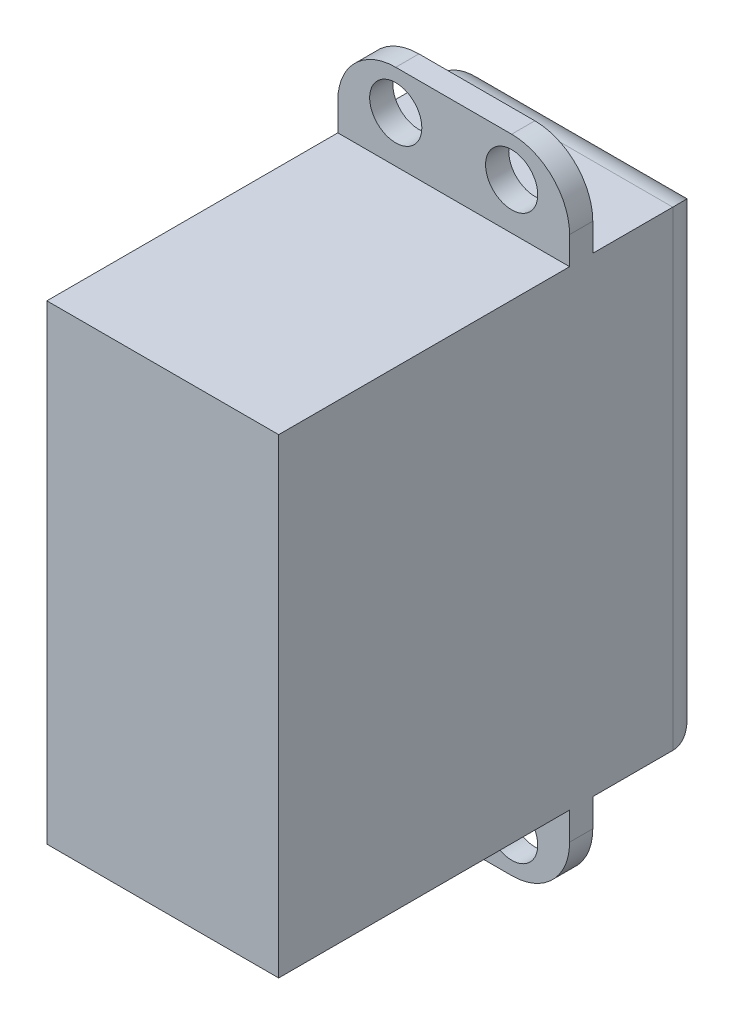
ISO-10303-21;
HEADER;
FILE_DESCRIPTION(('STEP AP214'),'2;1');
FILE_NAME('part.step','',(''),(''),'','','');
FILE_SCHEMA(('AUTOMOTIVE_DESIGN { 1 0 10303 214 1 1 1 1 }'));
ENDSEC;
DATA;
#1=APPLICATION_CONTEXT('core data for automotive mechanical design processes');
#2=APPLICATION_PROTOCOL_DEFINITION('international standard','automotive_design',2000,#1);
#3=PRODUCT_CONTEXT('',#1,'mechanical');
#4=PRODUCT('Part','Part','',(#3));
#5=PRODUCT_RELATED_PRODUCT_CATEGORY('part','',(#4));
#6=PRODUCT_DEFINITION_FORMATION('','',#4);
#7=PRODUCT_DEFINITION_CONTEXT('part definition',#1,'design');
#8=PRODUCT_DEFINITION('design','',#6,#7);
#9=PRODUCT_DEFINITION_SHAPE('','',#8);
#10=(LENGTH_UNIT() NAMED_UNIT(*) SI_UNIT(.MILLI.,.METRE.));
#11=(NAMED_UNIT(*) PLANE_ANGLE_UNIT() SI_UNIT($,.RADIAN.));
#12=(NAMED_UNIT(*) SI_UNIT($,.STERADIAN.) SOLID_ANGLE_UNIT());
#13=UNCERTAINTY_MEASURE_WITH_UNIT(LENGTH_MEASURE(1.E-05),#10,'distance_accuracy_value','');
#14=(GEOMETRIC_REPRESENTATION_CONTEXT(3) GLOBAL_UNCERTAINTY_ASSIGNED_CONTEXT((#13)) GLOBAL_UNIT_ASSIGNED_CONTEXT((#10,
#11,#12)) REPRESENTATION_CONTEXT('',''));
#15=CARTESIAN_POINT('',(0.,0.,0.));
#16=DIRECTION('',(0.,0.,1.));
#17=DIRECTION('',(1.,0.,0.));
#18=AXIS2_PLACEMENT_3D('',#15,#16,#17);
#19=CARTESIAN_POINT('',(-10.,20.3,-9.9));
#20=DIRECTION('',(0.,1.,0.));
#21=DIRECTION('',(0.,0.,1.));
#22=AXIS2_PLACEMENT_3D('',#19,#20,#21);
#23=PLANE('',#22);
#24=DIRECTION('',(0.,0.,1.));
#25=VECTOR('',#24,1.);
#26=CARTESIAN_POINT('',(10.,20.3,-9.9));
#27=LINE('',#26,#25);
#28=CARTESIAN_POINT('',(10.,20.3,2.));
#29=VERTEX_POINT('',#28);
#30=CARTESIAN_POINT('',(10.,20.3,27.1));
#31=VERTEX_POINT('',#30);
#32=EDGE_CURVE('E216',#29,#31,#27,.T.);
#33=ORIENTED_EDGE('',*,*,#32,.F.);
#34=DIRECTION('',(-1.,0.,0.));
#35=VECTOR('',#34,1.);
#36=CARTESIAN_POINT('',(-10.,20.3,2.));
#37=LINE('',#36,#35);
#38=CARTESIAN_POINT('',(-10.,20.3,2.));
#39=VERTEX_POINT('',#38);
#40=EDGE_CURVE('E189',#29,#39,#37,.T.);
#41=ORIENTED_EDGE('',*,*,#40,.T.);
#42=DIRECTION('',(0.,0.,1.));
#43=VECTOR('',#42,1.);
#44=CARTESIAN_POINT('',(-10.,20.3,-9.9));
#45=LINE('',#44,#43);
#46=CARTESIAN_POINT('',(-10.,20.3,27.1));
#47=VERTEX_POINT('',#46);
#48=EDGE_CURVE('E213',#39,#47,#45,.T.);
#49=ORIENTED_EDGE('',*,*,#48,.T.);
#50=DIRECTION('',(-1.,0.,0.));
#51=VECTOR('',#50,1.);
#52=CARTESIAN_POINT('',(-10.,20.3,27.1));
#53=LINE('',#52,#51);
#54=EDGE_CURVE('E206',#31,#47,#53,.T.);
#55=ORIENTED_EDGE('',*,*,#54,.F.);
#56=EDGE_LOOP('',(#33,#41,#49,#55));
#57=FACE_BOUND('',#56,.T.);
#58=ADVANCED_FACE('F34',(#57),#23,.T.);
#59=CARTESIAN_POINT('',(-10.,-20.3,-9.9));
#60=DIRECTION('',(0.,-1.,0.));
#61=DIRECTION('',(0.,0.,-1.));
#62=AXIS2_PLACEMENT_3D('',#59,#60,#61);
#63=PLANE('',#62);
#64=DIRECTION('',(0.,0.,1.));
#65=VECTOR('',#64,1.);
#66=CARTESIAN_POINT('',(-10.,-20.3,-9.9));
#67=LINE('',#66,#65);
#68=CARTESIAN_POINT('',(-10.,-20.3,2.));
#69=VERTEX_POINT('',#68);
#70=CARTESIAN_POINT('',(-10.,-20.3,27.1));
#71=VERTEX_POINT('',#70);
#72=EDGE_CURVE('E209',#69,#71,#67,.T.);
#73=ORIENTED_EDGE('',*,*,#72,.F.);
#74=DIRECTION('',(1.,0.,0.));
#75=VECTOR('',#74,1.);
#76=CARTESIAN_POINT('',(-10.,-20.3,2.));
#77=LINE('',#76,#75);
#78=CARTESIAN_POINT('',(9.99999999999999,-20.3,2.));
#79=VERTEX_POINT('',#78);
#80=EDGE_CURVE('E224',#69,#79,#77,.T.);
#81=ORIENTED_EDGE('',*,*,#80,.T.);
#82=DIRECTION('',(0.,0.,1.));
#83=VECTOR('',#82,1.);
#84=CARTESIAN_POINT('',(10.,-20.3,-9.9));
#85=LINE('',#84,#83);
#86=CARTESIAN_POINT('',(10.,-20.3,27.1));
#87=VERTEX_POINT('',#86);
#88=EDGE_CURVE('E219',#79,#87,#85,.T.);
#89=ORIENTED_EDGE('',*,*,#88,.T.);
#90=DIRECTION('',(1.,0.,0.));
#91=VECTOR('',#90,1.);
#92=CARTESIAN_POINT('',(-10.,-20.3,27.1));
#93=LINE('',#92,#91);
#94=EDGE_CURVE('E200',#71,#87,#93,.T.);
#95=ORIENTED_EDGE('',*,*,#94,.F.);
#96=EDGE_LOOP('',(#73,#81,#89,#95));
#97=FACE_BOUND('',#96,.T.);
#98=ADVANCED_FACE('F388',(#97),#63,.T.);
#99=CARTESIAN_POINT('',(-10.,20.3,-9.9));
#100=DIRECTION('',(-1.,0.,0.));
#101=DIRECTION('',(0.,0.,1.));
#102=AXIS2_PLACEMENT_3D('',#99,#100,#101);
#103=PLANE('',#102);
#104=CARTESIAN_POINT('',(-10.,20.3,-6.9));
#105=VERTEX_POINT('',#104);
#106=CARTESIAN_POINT('',(-10.,20.3,0.));
#107=VERTEX_POINT('',#106);
#108=EDGE_CURVE('E210',#105,#107,#45,.T.);
#109=ORIENTED_EDGE('',*,*,#108,.F.);
#110=DIRECTION('',(0.,-1.,0.));
#111=VECTOR('',#110,1.);
#112=CARTESIAN_POINT('',(-10.,-20.3,-6.9));
#113=LINE('',#112,#111);
#114=CARTESIAN_POINT('',(-10.,-20.3,-6.9));
#115=VERTEX_POINT('',#114);
#116=EDGE_CURVE('E42',#105,#115,#113,.T.);
#117=ORIENTED_EDGE('',*,*,#116,.T.);
#118=CARTESIAN_POINT('',(-10.,-20.3,0.));
#119=VERTEX_POINT('',#118);
#120=EDGE_CURVE('E220',#115,#119,#67,.T.);
#121=ORIENTED_EDGE('',*,*,#120,.T.);
#122=DIRECTION('',(0.,-1.,0.));
#123=VECTOR('',#122,1.);
#124=CARTESIAN_POINT('',(-10.,-22.7,0.));
#125=LINE('',#124,#123);
#126=CARTESIAN_POINT('',(-10.,-22.7,0.));
#127=VERTEX_POINT('',#126);
#128=EDGE_CURVE('E312',#119,#127,#125,.T.);
#129=ORIENTED_EDGE('',*,*,#128,.T.);
#130=DIRECTION('',(0.,0.,-1.));
#131=VECTOR('',#130,1.);
#132=CARTESIAN_POINT('',(-10.,-22.7,2.));
#133=LINE('',#132,#131);
#134=CARTESIAN_POINT('',(-10.,-22.7,2.));
#135=VERTEX_POINT('',#134);
#136=EDGE_CURVE('E296',#135,#127,#133,.T.);
#137=ORIENTED_EDGE('',*,*,#136,.F.);
#138=DIRECTION('',(0.,-1.,0.));
#139=VECTOR('',#138,1.);
#140=CARTESIAN_POINT('',(-10.,-22.7,2.));
#141=LINE('',#140,#139);
#142=EDGE_CURVE('E177',#69,#135,#141,.T.);
#143=ORIENTED_EDGE('',*,*,#142,.F.);
#144=ORIENTED_EDGE('',*,*,#72,.T.);
#145=DIRECTION('',(0.,-1.,0.));
#146=VECTOR('',#145,1.);
#147=CARTESIAN_POINT('',(-10.,20.3,27.1));
#148=LINE('',#147,#146);
#149=EDGE_CURVE('E197',#47,#71,#148,.T.);
#150=ORIENTED_EDGE('',*,*,#149,.F.);
#151=ORIENTED_EDGE('',*,*,#48,.F.);
#152=CARTESIAN_POINT('',(-10.,22.7,2.));
#153=VERTEX_POINT('',#152);
#154=EDGE_CURVE('E293',#153,#39,#141,.T.);
#155=ORIENTED_EDGE('',*,*,#154,.F.);
#156=DIRECTION('',(0.,0.,-1.));
#157=VECTOR('',#156,1.);
#158=CARTESIAN_POINT('',(-10.,22.7,2.));
#159=LINE('',#158,#157);
#160=CARTESIAN_POINT('',(-10.,22.7,0.));
#161=VERTEX_POINT('',#160);
#162=EDGE_CURVE('E316',#153,#161,#159,.T.);
#163=ORIENTED_EDGE('',*,*,#162,.T.);
#164=EDGE_CURVE('E181',#161,#107,#125,.T.);
#165=ORIENTED_EDGE('',*,*,#164,.T.);
#166=EDGE_LOOP('',(#109,#117,#121,#129,#137,#143,#144,#150,#151,#155,#163,#165));
#167=FACE_BOUND('',#166,.T.);
#168=ADVANCED_FACE('F356',(#167),#103,.T.);
#169=CARTESIAN_POINT('',(10.,20.3,-6.9));
#170=VERTEX_POINT('',#169);
#171=CARTESIAN_POINT('',(10.,20.3,0.));
#172=VERTEX_POINT('',#171);
#173=EDGE_CURVE('E214',#170,#172,#27,.T.);
#174=ORIENTED_EDGE('',*,*,#173,.F.);
#175=DIRECTION('',(-1.,0.,0.));
#176=VECTOR('',#175,1.);
#177=CARTESIAN_POINT('',(-10.,20.3,-6.9));
#178=LINE('',#177,#176);
#179=EDGE_CURVE('E49',#170,#105,#178,.T.);
#180=ORIENTED_EDGE('',*,*,#179,.T.);
#181=ORIENTED_EDGE('',*,*,#108,.T.);
#182=DIRECTION('',(-1.,0.,0.));
#183=VECTOR('',#182,1.);
#184=CARTESIAN_POINT('',(-10.,20.3,0.));
#185=LINE('',#184,#183);
#186=EDGE_CURVE('E186',#172,#107,#185,.T.);
#187=ORIENTED_EDGE('',*,*,#186,.F.);
#188=EDGE_LOOP('',(#174,#180,#181,#187));
#189=FACE_BOUND('',#188,.T.);
#190=ADVANCED_FACE('F359',(#189),#23,.T.);
#191=CARTESIAN_POINT('',(10.,20.3,-9.9));
#192=DIRECTION('',(1.,0.,0.));
#193=DIRECTION('',(0.,0.,-1.));
#194=AXIS2_PLACEMENT_3D('',#191,#192,#193);
#195=PLANE('',#194);
#196=CARTESIAN_POINT('',(10.,-20.3,-6.9));
#197=VERTEX_POINT('',#196);
#198=CARTESIAN_POINT('',(9.99999999999999,-20.3,0.));
#199=VERTEX_POINT('',#198);
#200=EDGE_CURVE('E217',#197,#199,#85,.T.);
#201=ORIENTED_EDGE('',*,*,#200,.F.);
#202=DIRECTION('',(0.,1.,0.));
#203=VECTOR('',#202,1.);
#204=CARTESIAN_POINT('',(10.,20.3,-6.9));
#205=LINE('',#204,#203);
#206=EDGE_CURVE('E57',#197,#170,#205,.T.);
#207=ORIENTED_EDGE('',*,*,#206,.T.);
#208=ORIENTED_EDGE('',*,*,#173,.T.);
#209=DIRECTION('',(0.,1.,0.));
#210=VECTOR('',#209,1.);
#211=CARTESIAN_POINT('',(9.99999999999999,-22.7,0.));
#212=LINE('',#211,#210);
#213=CARTESIAN_POINT('',(9.99999999999999,22.7,0.));
#214=VERTEX_POINT('',#213);
#215=EDGE_CURVE('E302',#172,#214,#212,.T.);
#216=ORIENTED_EDGE('',*,*,#215,.T.);
#217=DIRECTION('',(0.,0.,-1.));
#218=VECTOR('',#217,1.);
#219=CARTESIAN_POINT('',(9.99999999999999,22.7,2.));
#220=LINE('',#219,#218);
#221=CARTESIAN_POINT('',(9.99999999999999,22.7,2.));
#222=VERTEX_POINT('',#221);
#223=EDGE_CURVE('E325',#222,#214,#220,.T.);
#224=ORIENTED_EDGE('',*,*,#223,.F.);
#225=DIRECTION('',(0.,1.,0.));
#226=VECTOR('',#225,1.);
#227=CARTESIAN_POINT('',(9.99999999999999,-22.7,2.));
#228=LINE('',#227,#226);
#229=EDGE_CURVE('E284',#29,#222,#228,.T.);
#230=ORIENTED_EDGE('',*,*,#229,.F.);
#231=ORIENTED_EDGE('',*,*,#32,.T.);
#232=DIRECTION('',(0.,1.,0.));
#233=VECTOR('',#232,1.);
#234=CARTESIAN_POINT('',(10.,20.3,27.1));
#235=LINE('',#234,#233);
#236=EDGE_CURVE('E203',#87,#31,#235,.T.);
#237=ORIENTED_EDGE('',*,*,#236,.F.);
#238=ORIENTED_EDGE('',*,*,#88,.F.);
#239=CARTESIAN_POINT('',(9.99999999999999,-22.7,2.));
#240=VERTEX_POINT('',#239);
#241=EDGE_CURVE('E285',#240,#79,#228,.T.);
#242=ORIENTED_EDGE('',*,*,#241,.F.);
#243=DIRECTION('',(0.,0.,-1.));
#244=VECTOR('',#243,1.);
#245=CARTESIAN_POINT('',(9.99999999999999,-22.7,2.));
#246=LINE('',#245,#244);
#247=CARTESIAN_POINT('',(9.99999999999999,-22.7,0.));
#248=VERTEX_POINT('',#247);
#249=EDGE_CURVE('E191',#240,#248,#246,.T.);
#250=ORIENTED_EDGE('',*,*,#249,.T.);
#251=EDGE_CURVE('E303',#248,#199,#212,.T.);
#252=ORIENTED_EDGE('',*,*,#251,.T.);
#253=EDGE_LOOP('',(#201,#207,#208,#216,#224,#230,#231,#237,#238,#242,#250,#252));
#254=FACE_BOUND('',#253,.T.);
#255=ADVANCED_FACE('F331',(#254),#195,.T.);
#256=ORIENTED_EDGE('',*,*,#120,.F.);
#257=DIRECTION('',(1.,0.,0.));
#258=VECTOR('',#257,1.);
#259=CARTESIAN_POINT('',(10.,-20.3,-6.9));
#260=LINE('',#259,#258);
#261=EDGE_CURVE('E227',#115,#197,#260,.T.);
#262=ORIENTED_EDGE('',*,*,#261,.T.);
#263=ORIENTED_EDGE('',*,*,#200,.T.);
#264=DIRECTION('',(1.,0.,0.));
#265=VECTOR('',#264,1.);
#266=CARTESIAN_POINT('',(-10.,-20.3,0.));
#267=LINE('',#266,#265);
#268=EDGE_CURVE('E212',#119,#199,#267,.T.);
#269=ORIENTED_EDGE('',*,*,#268,.F.);
#270=EDGE_LOOP('',(#256,#262,#263,#269));
#271=FACE_BOUND('',#270,.T.);
#272=ADVANCED_FACE('F341',(#271),#63,.T.);
#273=CARTESIAN_POINT('',(0.,0.,-9.9));
#274=DIRECTION('',(0.,0.,1.));
#275=DIRECTION('',(1.,0.,0.));
#276=AXIS2_PLACEMENT_3D('',#273,#274,#275);
#277=PLANE('',#276);
#278=CARTESIAN_POINT('',(0.,9.8,-9.9));
#279=DIRECTION('',(0.,0.,1.));
#280=DIRECTION('',(1.,0.,0.));
#281=AXIS2_PLACEMENT_3D('',#278,#279,#280);
#282=CIRCLE('',#281,3.);
#283=CARTESIAN_POINT('',(3.,9.8,-9.9));
#284=VERTEX_POINT('',#283);
#285=EDGE_CURVE('E11',#284,#284,#282,.F.);
#286=ORIENTED_EDGE('',*,*,#285,.F.);
#287=EDGE_LOOP('',(#286));
#288=FACE_BOUND('',#287,.T.);
#289=DIRECTION('',(0.,1.,0.));
#290=VECTOR('',#289,1.);
#291=CARTESIAN_POINT('',(7.00000000000001,-20.3,-9.9));
#292=LINE('',#291,#290);
#293=CARTESIAN_POINT('',(7.00000000000001,17.3,-9.9));
#294=VERTEX_POINT('',#293);
#295=CARTESIAN_POINT('',(7.00000000000001,-17.3,-9.9));
#296=VERTEX_POINT('',#295);
#297=EDGE_CURVE('E234',#294,#296,#292,.F.);
#298=ORIENTED_EDGE('',*,*,#297,.T.);
#299=DIRECTION('',(1.,0.,0.));
#300=VECTOR('',#299,1.);
#301=CARTESIAN_POINT('',(-10.,-17.3,-9.9));
#302=LINE('',#301,#300);
#303=CARTESIAN_POINT('',(-7.00000000000001,-17.3,-9.9));
#304=VERTEX_POINT('',#303);
#305=EDGE_CURVE('E236',#296,#304,#302,.F.);
#306=ORIENTED_EDGE('',*,*,#305,.T.);
#307=DIRECTION('',(0.,-1.,0.));
#308=VECTOR('',#307,1.);
#309=CARTESIAN_POINT('',(-7.00000000000001,20.3,-9.9));
#310=LINE('',#309,#308);
#311=CARTESIAN_POINT('',(-7.00000000000001,17.3,-9.9));
#312=VERTEX_POINT('',#311);
#313=EDGE_CURVE('E230',#304,#312,#310,.F.);
#314=ORIENTED_EDGE('',*,*,#313,.T.);
#315=DIRECTION('',(-1.,0.,0.));
#316=VECTOR('',#315,1.);
#317=CARTESIAN_POINT('',(10.,17.3,-9.9));
#318=LINE('',#317,#316);
#319=EDGE_CURVE('E232',#312,#294,#318,.F.);
#320=ORIENTED_EDGE('',*,*,#319,.T.);
#321=EDGE_LOOP('',(#298,#306,#314,#320));
#322=FACE_BOUND('',#321,.T.);
#323=ADVANCED_FACE('F526',(#288,#322),#277,.F.);
#324=CARTESIAN_POINT('',(0.,0.,27.1));
#325=DIRECTION('',(0.,0.,1.));
#326=DIRECTION('',(1.,0.,0.));
#327=AXIS2_PLACEMENT_3D('',#324,#325,#326);
#328=PLANE('',#327);
#329=ORIENTED_EDGE('',*,*,#149,.T.);
#330=ORIENTED_EDGE('',*,*,#94,.T.);
#331=ORIENTED_EDGE('',*,*,#236,.T.);
#332=ORIENTED_EDGE('',*,*,#54,.T.);
#333=EDGE_LOOP('',(#329,#330,#331,#332));
#334=FACE_BOUND('',#333,.T.);
#335=ADVANCED_FACE('F382',(#334),#328,.T.);
#336=CARTESIAN_POINT('',(-5.,-24.3,2.));
#337=DIRECTION('',(0.,0.,-1.));
#338=DIRECTION('',(-1.,0.,0.));
#339=AXIS2_PLACEMENT_3D('',#336,#337,#338);
#340=CYLINDRICAL_SURFACE('',#339,2.25);
#341=CARTESIAN_POINT('',(-5.,-24.3,2.));
#342=DIRECTION('',(0.,0.,1.));
#343=DIRECTION('',(-1.,0.,0.));
#344=AXIS2_PLACEMENT_3D('',#341,#342,#343);
#345=CIRCLE('',#344,2.25);
#346=CARTESIAN_POINT('',(-7.25,-24.3,2.));
#347=VERTEX_POINT('',#346);
#348=EDGE_CURVE('E257',#347,#347,#345,.T.);
#349=ORIENTED_EDGE('',*,*,#348,.T.);
#350=EDGE_LOOP('',(#349));
#351=FACE_BOUND('',#350,.T.);
#352=CARTESIAN_POINT('',(-5.,-24.3,0.));
#353=DIRECTION('',(0.,0.,1.));
#354=DIRECTION('',(-1.,0.,0.));
#355=AXIS2_PLACEMENT_3D('',#352,#353,#354);
#356=CIRCLE('',#355,2.25);
#357=CARTESIAN_POINT('',(-7.25,-24.3,0.));
#358=VERTEX_POINT('',#357);
#359=EDGE_CURVE('E251',#358,#358,#356,.T.);
#360=ORIENTED_EDGE('',*,*,#359,.F.);
#361=EDGE_LOOP('',(#360));
#362=FACE_BOUND('',#361,.T.);
#363=ADVANCED_FACE('F499',(#351,#362),#340,.F.);
#364=CARTESIAN_POINT('',(-4.99999999999998,-27.7,2.));
#365=DIRECTION('',(0.,1.,0.));
#366=DIRECTION('',(0.,0.,1.));
#367=AXIS2_PLACEMENT_3D('',#364,#365,#366);
#368=PLANE('',#367);
#369=DIRECTION('',(1.,0.,0.));
#370=VECTOR('',#369,1.);
#371=CARTESIAN_POINT('',(-4.99999999999998,-27.7,0.));
#372=LINE('',#371,#370);
#373=CARTESIAN_POINT('',(-4.99999999999998,-27.7,0.));
#374=VERTEX_POINT('',#373);
#375=CARTESIAN_POINT('',(4.99999999999995,-27.7,0.));
#376=VERTEX_POINT('',#375);
#377=EDGE_CURVE('E298',#374,#376,#372,.T.);
#378=ORIENTED_EDGE('',*,*,#377,.T.);
#379=DIRECTION('',(0.,0.,-1.));
#380=VECTOR('',#379,1.);
#381=CARTESIAN_POINT('',(4.99999999999995,-27.7,2.));
#382=LINE('',#381,#380);
#383=CARTESIAN_POINT('',(4.99999999999995,-27.7,2.));
#384=VERTEX_POINT('',#383);
#385=EDGE_CURVE('E167',#384,#376,#382,.T.);
#386=ORIENTED_EDGE('',*,*,#385,.F.);
#387=DIRECTION('',(1.,0.,0.));
#388=VECTOR('',#387,1.);
#389=CARTESIAN_POINT('',(-4.99999999999998,-27.7,2.));
#390=LINE('',#389,#388);
#391=CARTESIAN_POINT('',(-4.99999999999998,-27.7,2.));
#392=VERTEX_POINT('',#391);
#393=EDGE_CURVE('E160',#392,#384,#390,.T.);
#394=ORIENTED_EDGE('',*,*,#393,.F.);
#395=DIRECTION('',(0.,0.,-1.));
#396=VECTOR('',#395,1.);
#397=CARTESIAN_POINT('',(-4.99999999999998,-27.7,2.));
#398=LINE('',#397,#396);
#399=EDGE_CURVE('E164',#392,#374,#398,.T.);
#400=ORIENTED_EDGE('',*,*,#399,.T.);
#401=EDGE_LOOP('',(#378,#386,#394,#400));
#402=FACE_BOUND('',#401,.T.);
#403=ADVANCED_FACE('F162',(#402),#368,.F.);
#404=CARTESIAN_POINT('',(5.,-24.3,2.));
#405=DIRECTION('',(0.,0.,-1.));
#406=DIRECTION('',(-1.,0.,0.));
#407=AXIS2_PLACEMENT_3D('',#404,#405,#406);
#408=CYLINDRICAL_SURFACE('',#407,2.25);
#409=CARTESIAN_POINT('',(5.,-24.3,2.));
#410=DIRECTION('',(0.,0.,1.));
#411=DIRECTION('',(1.,0.,0.));
#412=AXIS2_PLACEMENT_3D('',#409,#410,#411);
#413=CIRCLE('',#412,2.25);
#414=CARTESIAN_POINT('',(7.25,-24.3,2.));
#415=VERTEX_POINT('',#414);
#416=EDGE_CURVE('E266',#415,#415,#413,.T.);
#417=ORIENTED_EDGE('',*,*,#416,.T.);
#418=EDGE_LOOP('',(#417));
#419=FACE_BOUND('',#418,.T.);
#420=CARTESIAN_POINT('',(5.,-24.3,0.));
#421=DIRECTION('',(0.,0.,1.));
#422=DIRECTION('',(1.,0.,0.));
#423=AXIS2_PLACEMENT_3D('',#420,#421,#422);
#424=CIRCLE('',#423,2.25);
#425=CARTESIAN_POINT('',(7.25,-24.3,0.));
#426=VERTEX_POINT('',#425);
#427=EDGE_CURVE('E262',#426,#426,#424,.T.);
#428=ORIENTED_EDGE('',*,*,#427,.F.);
#429=EDGE_LOOP('',(#428));
#430=FACE_BOUND('',#429,.T.);
#431=ADVANCED_FACE('F391',(#419,#430),#408,.F.);
#432=CARTESIAN_POINT('',(4.99999999999999,-22.7,2.));
#433=DIRECTION('',(0.,0.,-1.));
#434=DIRECTION('',(-1.,0.,0.));
#435=AXIS2_PLACEMENT_3D('',#432,#433,#434);
#436=CYLINDRICAL_SURFACE('',#435,5.);
#437=CARTESIAN_POINT('',(4.99999999999999,-22.7,0.));
#438=DIRECTION('',(0.,0.,1.));
#439=DIRECTION('',(1.,0.,0.));
#440=AXIS2_PLACEMENT_3D('',#437,#438,#439);
#441=CIRCLE('',#440,5.);
#442=EDGE_CURVE('E300',#376,#248,#441,.T.);
#443=ORIENTED_EDGE('',*,*,#442,.T.);
#444=ORIENTED_EDGE('',*,*,#249,.F.);
#445=CARTESIAN_POINT('',(4.99999999999999,-22.7,2.));
#446=DIRECTION('',(0.,0.,1.));
#447=DIRECTION('',(1.,0.,0.));
#448=AXIS2_PLACEMENT_3D('',#445,#446,#447);
#449=CIRCLE('',#448,5.);
#450=EDGE_CURVE('E170',#384,#240,#449,.T.);
#451=ORIENTED_EDGE('',*,*,#450,.F.);
#452=ORIENTED_EDGE('',*,*,#385,.T.);
#453=EDGE_LOOP('',(#443,#444,#451,#452));
#454=FACE_BOUND('',#453,.T.);
#455=ADVANCED_FACE('F389',(#454),#436,.T.);
#456=CARTESIAN_POINT('',(-5.00000000000001,-22.7,2.));
#457=DIRECTION('',(0.,0.,-1.));
#458=DIRECTION('',(-1.,0.,0.));
#459=AXIS2_PLACEMENT_3D('',#456,#457,#458);
#460=CYLINDRICAL_SURFACE('',#459,5.);
#461=CARTESIAN_POINT('',(-5.00000000000001,-22.7,0.));
#462=DIRECTION('',(0.,0.,1.));
#463=DIRECTION('',(-1.,0.,0.));
#464=AXIS2_PLACEMENT_3D('',#461,#462,#463);
#465=CIRCLE('',#464,5.);
#466=EDGE_CURVE('E185',#127,#374,#465,.T.);
#467=ORIENTED_EDGE('',*,*,#466,.T.);
#468=ORIENTED_EDGE('',*,*,#399,.F.);
#469=CARTESIAN_POINT('',(-5.00000000000001,-22.7,2.));
#470=DIRECTION('',(0.,0.,1.));
#471=DIRECTION('',(-1.,0.,0.));
#472=AXIS2_PLACEMENT_3D('',#469,#470,#471);
#473=CIRCLE('',#472,5.);
#474=EDGE_CURVE('E171',#135,#392,#473,.T.);
#475=ORIENTED_EDGE('',*,*,#474,.F.);
#476=ORIENTED_EDGE('',*,*,#136,.T.);
#477=EDGE_LOOP('',(#467,#468,#475,#476));
#478=FACE_BOUND('',#477,.T.);
#479=ADVANCED_FACE('F183',(#478),#460,.T.);
#480=CARTESIAN_POINT('',(-5.00000000000001,-22.7,0.));
#481=DIRECTION('',(0.,0.,-1.));
#482=DIRECTION('',(-1.,0.,0.));
#483=AXIS2_PLACEMENT_3D('',#480,#481,#482);
#484=PLANE('',#483);
#485=ORIENTED_EDGE('',*,*,#427,.T.);
#486=EDGE_LOOP('',(#485));
#487=FACE_BOUND('',#486,.T.);
#488=ORIENTED_EDGE('',*,*,#128,.F.);
#489=ORIENTED_EDGE('',*,*,#268,.T.);
#490=ORIENTED_EDGE('',*,*,#251,.F.);
#491=ORIENTED_EDGE('',*,*,#442,.F.);
#492=ORIENTED_EDGE('',*,*,#377,.F.);
#493=ORIENTED_EDGE('',*,*,#466,.F.);
#494=EDGE_LOOP('',(#488,#489,#490,#491,#492,#493));
#495=FACE_BOUND('',#494,.T.);
#496=ORIENTED_EDGE('',*,*,#359,.T.);
#497=EDGE_LOOP('',(#496));
#498=FACE_BOUND('',#497,.T.);
#499=ADVANCED_FACE('F337',(#487,#495,#498),#484,.T.);
#500=CARTESIAN_POINT('',(-5.00000000000001,-22.7,2.));
#501=DIRECTION('',(0.,0.,-1.));
#502=DIRECTION('',(-1.,0.,0.));
#503=AXIS2_PLACEMENT_3D('',#500,#501,#502);
#504=PLANE('',#503);
#505=ORIENTED_EDGE('',*,*,#80,.F.);
#506=ORIENTED_EDGE('',*,*,#142,.T.);
#507=ORIENTED_EDGE('',*,*,#474,.T.);
#508=ORIENTED_EDGE('',*,*,#393,.T.);
#509=ORIENTED_EDGE('',*,*,#450,.T.);
#510=ORIENTED_EDGE('',*,*,#241,.T.);
#511=EDGE_LOOP('',(#505,#506,#507,#508,#509,#510));
#512=FACE_BOUND('',#511,.T.);
#513=ORIENTED_EDGE('',*,*,#416,.F.);
#514=EDGE_LOOP('',(#513));
#515=FACE_BOUND('',#514,.T.);
#516=ORIENTED_EDGE('',*,*,#348,.F.);
#517=EDGE_LOOP('',(#516));
#518=FACE_BOUND('',#517,.T.);
#519=ADVANCED_FACE('F175',(#512,#515,#518),#504,.F.);
#520=ORIENTED_EDGE('',*,*,#40,.F.);
#521=ORIENTED_EDGE('',*,*,#229,.T.);
#522=CARTESIAN_POINT('',(4.99999999999999,22.7,2.));
#523=DIRECTION('',(0.,0.,1.));
#524=DIRECTION('',(1.,0.,0.));
#525=AXIS2_PLACEMENT_3D('',#522,#523,#524);
#526=CIRCLE('',#525,5.);
#527=CARTESIAN_POINT('',(4.99999999999995,27.7,2.));
#528=VERTEX_POINT('',#527);
#529=EDGE_CURVE('E287',#222,#528,#526,.T.);
#530=ORIENTED_EDGE('',*,*,#529,.T.);
#531=DIRECTION('',(-1.,0.,0.));
#532=VECTOR('',#531,1.);
#533=CARTESIAN_POINT('',(-4.99999999999998,27.7,2.));
#534=LINE('',#533,#532);
#535=CARTESIAN_POINT('',(-4.99999999999998,27.7,2.));
#536=VERTEX_POINT('',#535);
#537=EDGE_CURVE('E289',#528,#536,#534,.T.);
#538=ORIENTED_EDGE('',*,*,#537,.T.);
#539=CARTESIAN_POINT('',(-5.00000000000001,22.7,2.));
#540=DIRECTION('',(0.,0.,1.));
#541=DIRECTION('',(-1.,0.,0.));
#542=AXIS2_PLACEMENT_3D('',#539,#540,#541);
#543=CIRCLE('',#542,5.);
#544=EDGE_CURVE('E291',#536,#153,#543,.T.);
#545=ORIENTED_EDGE('',*,*,#544,.T.);
#546=ORIENTED_EDGE('',*,*,#154,.T.);
#547=EDGE_LOOP('',(#520,#521,#530,#538,#545,#546));
#548=FACE_BOUND('',#547,.T.);
#549=CARTESIAN_POINT('',(5.,24.3,2.));
#550=DIRECTION('',(0.,0.,1.));
#551=DIRECTION('',(-1.,0.,0.));
#552=AXIS2_PLACEMENT_3D('',#549,#550,#551);
#553=CIRCLE('',#552,2.25);
#554=CARTESIAN_POINT('',(2.75,24.3,2.));
#555=VERTEX_POINT('',#554);
#556=EDGE_CURVE('E272',#555,#555,#553,.T.);
#557=ORIENTED_EDGE('',*,*,#556,.F.);
#558=EDGE_LOOP('',(#557));
#559=FACE_BOUND('',#558,.T.);
#560=CARTESIAN_POINT('',(-5.,24.3,2.));
#561=DIRECTION('',(0.,0.,1.));
#562=DIRECTION('',(1.,0.,0.));
#563=AXIS2_PLACEMENT_3D('',#560,#561,#562);
#564=CIRCLE('',#563,2.25);
#565=CARTESIAN_POINT('',(-2.75,24.3,2.));
#566=VERTEX_POINT('',#565);
#567=EDGE_CURVE('E278',#566,#566,#564,.T.);
#568=ORIENTED_EDGE('',*,*,#567,.F.);
#569=EDGE_LOOP('',(#568));
#570=FACE_BOUND('',#569,.T.);
#571=ADVANCED_FACE('F375',(#548,#559,#570),#504,.F.);
#572=CARTESIAN_POINT('',(5.,24.3,0.));
#573=DIRECTION('',(0.,0.,1.));
#574=DIRECTION('',(-1.,0.,0.));
#575=AXIS2_PLACEMENT_3D('',#572,#573,#574);
#576=CIRCLE('',#575,2.25);
#577=CARTESIAN_POINT('',(2.75,24.3,0.));
#578=VERTEX_POINT('',#577);
#579=EDGE_CURVE('E269',#578,#578,#576,.T.);
#580=ORIENTED_EDGE('',*,*,#579,.T.);
#581=EDGE_LOOP('',(#580));
#582=FACE_BOUND('',#581,.T.);
#583=CARTESIAN_POINT('',(-5.,24.3,0.));
#584=DIRECTION('',(0.,0.,1.));
#585=DIRECTION('',(1.,0.,0.));
#586=AXIS2_PLACEMENT_3D('',#583,#584,#585);
#587=CIRCLE('',#586,2.25);
#588=CARTESIAN_POINT('',(-2.75,24.3,0.));
#589=VERTEX_POINT('',#588);
#590=EDGE_CURVE('E275',#589,#589,#587,.T.);
#591=ORIENTED_EDGE('',*,*,#590,.T.);
#592=EDGE_LOOP('',(#591));
#593=FACE_BOUND('',#592,.T.);
#594=ORIENTED_EDGE('',*,*,#215,.F.);
#595=ORIENTED_EDGE('',*,*,#186,.T.);
#596=ORIENTED_EDGE('',*,*,#164,.F.);
#597=CARTESIAN_POINT('',(-5.00000000000001,22.7,0.));
#598=DIRECTION('',(0.,0.,1.));
#599=DIRECTION('',(-1.,0.,0.));
#600=AXIS2_PLACEMENT_3D('',#597,#598,#599);
#601=CIRCLE('',#600,5.);
#602=CARTESIAN_POINT('',(-4.99999999999998,27.7,0.));
#603=VERTEX_POINT('',#602);
#604=EDGE_CURVE('E310',#603,#161,#601,.T.);
#605=ORIENTED_EDGE('',*,*,#604,.F.);
#606=DIRECTION('',(-1.,0.,0.));
#607=VECTOR('',#606,1.);
#608=CARTESIAN_POINT('',(-4.99999999999998,27.7,0.));
#609=LINE('',#608,#607);
#610=CARTESIAN_POINT('',(4.99999999999995,27.7,0.));
#611=VERTEX_POINT('',#610);
#612=EDGE_CURVE('E308',#611,#603,#609,.T.);
#613=ORIENTED_EDGE('',*,*,#612,.F.);
#614=CARTESIAN_POINT('',(4.99999999999999,22.7,0.));
#615=DIRECTION('',(0.,0.,1.));
#616=DIRECTION('',(1.,0.,0.));
#617=AXIS2_PLACEMENT_3D('',#614,#615,#616);
#618=CIRCLE('',#617,5.);
#619=EDGE_CURVE('E306',#214,#611,#618,.T.);
#620=ORIENTED_EDGE('',*,*,#619,.F.);
#621=EDGE_LOOP('',(#594,#595,#596,#605,#613,#620));
#622=FACE_BOUND('',#621,.T.);
#623=ADVANCED_FACE('F362',(#582,#593,#622),#484,.T.);
#624=CARTESIAN_POINT('',(4.99999999999999,22.7,2.));
#625=DIRECTION('',(0.,0.,-1.));
#626=DIRECTION('',(-1.,0.,0.));
#627=AXIS2_PLACEMENT_3D('',#624,#625,#626);
#628=CYLINDRICAL_SURFACE('',#627,5.);
#629=ORIENTED_EDGE('',*,*,#619,.T.);
#630=DIRECTION('',(0.,0.,-1.));
#631=VECTOR('',#630,1.);
#632=CARTESIAN_POINT('',(4.99999999999995,27.7,2.));
#633=LINE('',#632,#631);
#634=EDGE_CURVE('E322',#528,#611,#633,.T.);
#635=ORIENTED_EDGE('',*,*,#634,.F.);
#636=ORIENTED_EDGE('',*,*,#529,.F.);
#637=ORIENTED_EDGE('',*,*,#223,.T.);
#638=EDGE_LOOP('',(#629,#635,#636,#637));
#639=FACE_BOUND('',#638,.T.);
#640=ADVANCED_FACE('F370',(#639),#628,.T.);
#641=CARTESIAN_POINT('',(-4.99999999999998,27.7,2.));
#642=DIRECTION('',(0.,-1.,0.));
#643=DIRECTION('',(0.,0.,-1.));
#644=AXIS2_PLACEMENT_3D('',#641,#642,#643);
#645=PLANE('',#644);
#646=ORIENTED_EDGE('',*,*,#612,.T.);
#647=DIRECTION('',(0.,0.,-1.));
#648=VECTOR('',#647,1.);
#649=CARTESIAN_POINT('',(-4.99999999999998,27.7,2.));
#650=LINE('',#649,#648);
#651=EDGE_CURVE('E319',#536,#603,#650,.T.);
#652=ORIENTED_EDGE('',*,*,#651,.F.);
#653=ORIENTED_EDGE('',*,*,#537,.F.);
#654=ORIENTED_EDGE('',*,*,#634,.T.);
#655=EDGE_LOOP('',(#646,#652,#653,#654));
#656=FACE_BOUND('',#655,.T.);
#657=ADVANCED_FACE('F450',(#656),#645,.F.);
#658=CARTESIAN_POINT('',(-5.00000000000001,22.7,2.));
#659=DIRECTION('',(0.,0.,-1.));
#660=DIRECTION('',(-1.,0.,0.));
#661=AXIS2_PLACEMENT_3D('',#658,#659,#660);
#662=CYLINDRICAL_SURFACE('',#661,5.);
#663=ORIENTED_EDGE('',*,*,#604,.T.);
#664=ORIENTED_EDGE('',*,*,#162,.F.);
#665=ORIENTED_EDGE('',*,*,#544,.F.);
#666=ORIENTED_EDGE('',*,*,#651,.T.);
#667=EDGE_LOOP('',(#663,#664,#665,#666));
#668=FACE_BOUND('',#667,.T.);
#669=ADVANCED_FACE('F437',(#668),#662,.T.);
#670=CARTESIAN_POINT('',(-5.,24.3,2.));
#671=DIRECTION('',(0.,0.,-1.));
#672=DIRECTION('',(-1.,0.,0.));
#673=AXIS2_PLACEMENT_3D('',#670,#671,#672);
#674=CYLINDRICAL_SURFACE('',#673,2.25);
#675=ORIENTED_EDGE('',*,*,#567,.T.);
#676=EDGE_LOOP('',(#675));
#677=FACE_BOUND('',#676,.T.);
#678=ORIENTED_EDGE('',*,*,#590,.F.);
#679=EDGE_LOOP('',(#678));
#680=FACE_BOUND('',#679,.T.);
#681=ADVANCED_FACE('F431',(#677,#680),#674,.F.);
#682=CARTESIAN_POINT('',(5.,24.3,2.));
#683=DIRECTION('',(0.,0.,-1.));
#684=DIRECTION('',(-1.,0.,0.));
#685=AXIS2_PLACEMENT_3D('',#682,#683,#684);
#686=CYLINDRICAL_SURFACE('',#685,2.25);
#687=ORIENTED_EDGE('',*,*,#556,.T.);
#688=EDGE_LOOP('',(#687));
#689=FACE_BOUND('',#688,.T.);
#690=ORIENTED_EDGE('',*,*,#579,.F.);
#691=EDGE_LOOP('',(#690));
#692=FACE_BOUND('',#691,.T.);
#693=ADVANCED_FACE('F427',(#689,#692),#686,.F.);
#694=CARTESIAN_POINT('',(-10.,17.3,-6.9));
#695=DIRECTION('',(1.,0.,0.));
#696=DIRECTION('',(0.,0.,-1.));
#697=AXIS2_PLACEMENT_3D('',#694,#695,#696);
#698=CYLINDRICAL_SURFACE('',#697,3.);
#699=CARTESIAN_POINT('',(7.00000000000001,17.3,-6.9));
#700=DIRECTION('',(0.707106781186547,-0.707106781186547,0.));
#701=DIRECTION('',(0.707106781186547,0.707106781186547,0.));
#702=AXIS2_PLACEMENT_3D('',#699,#700,#701);
#703=ELLIPSE('',#702,4.24264068711928,3.);
#704=EDGE_CURVE('E247',#294,#170,#703,.T.);
#705=ORIENTED_EDGE('',*,*,#704,.F.);
#706=ORIENTED_EDGE('',*,*,#319,.F.);
#707=CARTESIAN_POINT('',(-7.00000000000001,17.3,-6.9));
#708=DIRECTION('',(0.707106781186547,0.707106781186547,0.));
#709=DIRECTION('',(-0.707106781186547,0.707106781186547,0.));
#710=AXIS2_PLACEMENT_3D('',#707,#708,#709);
#711=ELLIPSE('',#710,4.24264068711928,3.);
#712=EDGE_CURVE('E249',#105,#312,#711,.F.);
#713=ORIENTED_EDGE('',*,*,#712,.F.);
#714=ORIENTED_EDGE('',*,*,#179,.F.);
#715=EDGE_LOOP('',(#705,#706,#713,#714));
#716=FACE_BOUND('',#715,.T.);
#717=ADVANCED_FACE('F36',(#716),#698,.T.);
#718=CARTESIAN_POINT('',(-7.00000000000001,20.3,-6.9));
#719=DIRECTION('',(0.,1.,0.));
#720=DIRECTION('',(0.,0.,1.));
#721=AXIS2_PLACEMENT_3D('',#718,#719,#720);
#722=CYLINDRICAL_SURFACE('',#721,3.);
#723=ORIENTED_EDGE('',*,*,#712,.T.);
#724=ORIENTED_EDGE('',*,*,#313,.F.);
#725=CARTESIAN_POINT('',(-7.00000000000001,-17.3,-6.9));
#726=DIRECTION('',(-0.707106781186547,0.707106781186547,0.));
#727=DIRECTION('',(0.707106781186547,0.707106781186547,0.));
#728=AXIS2_PLACEMENT_3D('',#725,#726,#727);
#729=ELLIPSE('',#728,4.24264068711928,3.);
#730=EDGE_CURVE('E244',#115,#304,#729,.F.);
#731=ORIENTED_EDGE('',*,*,#730,.F.);
#732=ORIENTED_EDGE('',*,*,#116,.F.);
#733=EDGE_LOOP('',(#723,#724,#731,#732));
#734=FACE_BOUND('',#733,.T.);
#735=ADVANCED_FACE('F354',(#734),#722,.T.);
#736=CARTESIAN_POINT('',(7.00000000000001,20.3,-6.9));
#737=DIRECTION('',(0.,-1.,0.));
#738=DIRECTION('',(0.,0.,-1.));
#739=AXIS2_PLACEMENT_3D('',#736,#737,#738);
#740=CYLINDRICAL_SURFACE('',#739,3.);
#741=ORIENTED_EDGE('',*,*,#704,.T.);
#742=ORIENTED_EDGE('',*,*,#206,.F.);
#743=CARTESIAN_POINT('',(7.00000000000001,-17.3,-6.9));
#744=DIRECTION('',(-0.707106781186547,-0.707106781186547,0.));
#745=DIRECTION('',(0.707106781186547,-0.707106781186547,0.));
#746=AXIS2_PLACEMENT_3D('',#743,#744,#745);
#747=ELLIPSE('',#746,4.24264068711928,3.);
#748=EDGE_CURVE('E242',#296,#197,#747,.T.);
#749=ORIENTED_EDGE('',*,*,#748,.F.);
#750=ORIENTED_EDGE('',*,*,#297,.F.);
#751=EDGE_LOOP('',(#741,#742,#749,#750));
#752=FACE_BOUND('',#751,.T.);
#753=ADVANCED_FACE('F350',(#752),#740,.T.);
#754=CARTESIAN_POINT('',(-10.,-17.3,-6.9));
#755=DIRECTION('',(-1.,0.,0.));
#756=DIRECTION('',(0.,0.,1.));
#757=AXIS2_PLACEMENT_3D('',#754,#755,#756);
#758=CYLINDRICAL_SURFACE('',#757,3.);
#759=ORIENTED_EDGE('',*,*,#730,.T.);
#760=ORIENTED_EDGE('',*,*,#305,.F.);
#761=ORIENTED_EDGE('',*,*,#748,.T.);
#762=ORIENTED_EDGE('',*,*,#261,.F.);
#763=EDGE_LOOP('',(#759,#760,#761,#762));
#764=FACE_BOUND('',#763,.T.);
#765=ADVANCED_FACE('F345',(#764),#758,.T.);
#766=CARTESIAN_POINT('',(0.,9.8,-14.9));
#767=DIRECTION('',(0.,0.,1.));
#768=DIRECTION('',(1.,0.,0.));
#769=AXIS2_PLACEMENT_3D('',#766,#767,#768);
#770=CYLINDRICAL_SURFACE('',#769,3.);
#771=CARTESIAN_POINT('',(0.,9.8,-14.9));
#772=DIRECTION('',(0.,0.,-1.));
#773=DIRECTION('',(-1.,0.,0.));
#774=AXIS2_PLACEMENT_3D('',#771,#772,#773);
#775=CIRCLE('',#774,3.);
#776=CARTESIAN_POINT('',(-3.,9.8,-14.9));
#777=VERTEX_POINT('',#776);
#778=EDGE_CURVE('E245',#777,#777,#775,.T.);
#779=ORIENTED_EDGE('',*,*,#778,.F.);
#780=EDGE_LOOP('',(#779));
#781=FACE_BOUND('',#780,.T.);
#782=ORIENTED_EDGE('',*,*,#285,.T.);
#783=EDGE_LOOP('',(#782));
#784=FACE_BOUND('',#783,.T.);
#785=ADVANCED_FACE('F421',(#781,#784),#770,.T.);
#786=CARTESIAN_POINT('',(0.,9.8,-14.9));
#787=DIRECTION('',(0.,0.,-1.));
#788=DIRECTION('',(-1.,0.,0.));
#789=AXIS2_PLACEMENT_3D('',#786,#787,#788);
#790=PLANE('',#789);
#791=ORIENTED_EDGE('',*,*,#778,.T.);
#792=EDGE_LOOP('',(#791));
#793=FACE_BOUND('',#792,.T.);
#794=ADVANCED_FACE('F616',(#793),#790,.T.);
#795=CLOSED_SHELL('',(#58,#98,#168,#190,#255,#272,#323,#335,#363,#403,#431,#455,#479,#499,#519,
#571,#623,#640,#657,#669,#681,#693,#717,#735,#753,#765,#785,#794));
#796=MANIFOLD_SOLID_BREP('B2',#795);
#797=ADVANCED_BREP_SHAPE_REPRESENTATION('',(#18,#796),#14);
#798=SHAPE_DEFINITION_REPRESENTATION(#9,#797);
ENDSEC;
END-ISO-10303-21;
